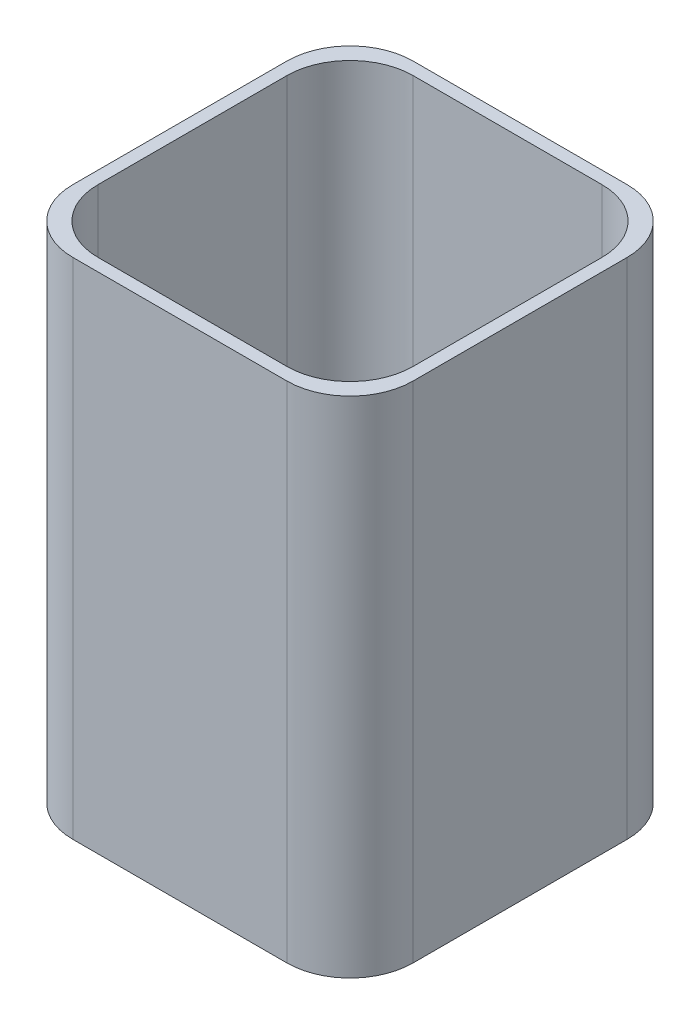
ISO-10303-21;
HEADER;
FILE_DESCRIPTION(('STEP AP214'),'2;1');
FILE_NAME('part.step','',(''),(''),'','','');
FILE_SCHEMA(('AUTOMOTIVE_DESIGN { 1 0 10303 214 1 1 1 1 }'));
ENDSEC;
DATA;
#1=APPLICATION_CONTEXT('core data for automotive mechanical design processes');
#2=APPLICATION_PROTOCOL_DEFINITION('international standard','automotive_design',2000,#1);
#3=PRODUCT_CONTEXT('',#1,'mechanical');
#4=PRODUCT('Part','Part','',(#3));
#5=PRODUCT_RELATED_PRODUCT_CATEGORY('part','',(#4));
#6=PRODUCT_DEFINITION_FORMATION('','',#4);
#7=PRODUCT_DEFINITION_CONTEXT('part definition',#1,'design');
#8=PRODUCT_DEFINITION('design','',#6,#7);
#9=PRODUCT_DEFINITION_SHAPE('','',#8);
#10=(LENGTH_UNIT() NAMED_UNIT(*) SI_UNIT(.MILLI.,.METRE.));
#11=(NAMED_UNIT(*) PLANE_ANGLE_UNIT() SI_UNIT($,.RADIAN.));
#12=(NAMED_UNIT(*) SI_UNIT($,.STERADIAN.) SOLID_ANGLE_UNIT());
#13=UNCERTAINTY_MEASURE_WITH_UNIT(LENGTH_MEASURE(1.E-05),#10,'distance_accuracy_value','');
#14=(GEOMETRIC_REPRESENTATION_CONTEXT(3) GLOBAL_UNCERTAINTY_ASSIGNED_CONTEXT((#13)) GLOBAL_UNIT_ASSIGNED_CONTEXT((#10,
#11,#12)) REPRESENTATION_CONTEXT('',''));
#15=CARTESIAN_POINT('',(0.,0.,0.));
#16=DIRECTION('',(0.,0.,1.));
#17=DIRECTION('',(1.,0.,0.));
#18=AXIS2_PLACEMENT_3D('',#15,#16,#17);
#19=CARTESIAN_POINT('',(-80.3315321017228,80.,-46.4451328481612));
#20=DIRECTION('',(1.,0.,0.));
#21=DIRECTION('',(0.,0.,-1.));
#22=AXIS2_PLACEMENT_3D('',#19,#20,#21);
#23=PLANE('',#22);
#24=DIRECTION('',(0.,0.,1.));
#25=VECTOR('',#24,1.);
#26=CARTESIAN_POINT('',(-80.3315321017228,80.,-46.4451328481612));
#27=LINE('',#26,#25);
#28=CARTESIAN_POINT('',(-80.3315321017228,80.,-36.4451328481612));
#29=VERTEX_POINT('',#28);
#30=CARTESIAN_POINT('',(-80.3315321017228,80.,-2.44513284816123));
#31=VERTEX_POINT('',#30);
#32=EDGE_CURVE('E186',#29,#31,#27,.T.);
#33=ORIENTED_EDGE('',*,*,#32,.F.);
#34=DIRECTION('',(0.,-1.,0.));
#35=VECTOR('',#34,1.);
#36=CARTESIAN_POINT('',(-80.3315321017228,80.,-36.4451328481612));
#37=LINE('',#36,#35);
#38=CARTESIAN_POINT('',(-80.3315321017228,0.,-36.4451328481612));
#39=VERTEX_POINT('',#38);
#40=EDGE_CURVE('E235',#29,#39,#37,.T.);
#41=ORIENTED_EDGE('',*,*,#40,.T.);
#42=DIRECTION('',(0.,0.,1.));
#43=VECTOR('',#42,1.);
#44=CARTESIAN_POINT('',(-80.3315321017228,0.,-46.4451328481612));
#45=LINE('',#44,#43);
#46=CARTESIAN_POINT('',(-80.3315321017228,0.,-2.44513284816123));
#47=VERTEX_POINT('',#46);
#48=EDGE_CURVE('E197',#39,#47,#45,.T.);
#49=ORIENTED_EDGE('',*,*,#48,.T.);
#50=DIRECTION('',(0.,-1.,0.));
#51=VECTOR('',#50,1.);
#52=CARTESIAN_POINT('',(-80.3315321017228,80.,-2.44513284816123));
#53=LINE('',#52,#51);
#54=EDGE_CURVE('E233',#47,#31,#53,.F.);
#55=ORIENTED_EDGE('',*,*,#54,.T.);
#56=EDGE_LOOP('',(#33,#41,#49,#55));
#57=FACE_BOUND('',#56,.T.);
#58=ADVANCED_FACE('F33',(#57),#23,.F.);
#59=CARTESIAN_POINT('',(-80.3315321017228,80.,7.55486715183876));
#60=DIRECTION('',(0.,0.,-1.));
#61=DIRECTION('',(-1.,0.,0.));
#62=AXIS2_PLACEMENT_3D('',#59,#60,#61);
#63=PLANE('',#62);
#64=DIRECTION('',(1.,0.,0.));
#65=VECTOR('',#64,1.);
#66=CARTESIAN_POINT('',(-80.3315321017228,0.,7.55486715183876));
#67=LINE('',#66,#65);
#68=CARTESIAN_POINT('',(-70.3315321017228,0.,7.55486715183876));
#69=VERTEX_POINT('',#68);
#70=CARTESIAN_POINT('',(-36.3315321017228,0.,7.55486715183876));
#71=VERTEX_POINT('',#70);
#72=EDGE_CURVE('E200',#69,#71,#67,.T.);
#73=ORIENTED_EDGE('',*,*,#72,.T.);
#74=DIRECTION('',(0.,-1.,0.));
#75=VECTOR('',#74,1.);
#76=CARTESIAN_POINT('',(-36.3315321017228,80.,7.55486715183876));
#77=LINE('',#76,#75);
#78=CARTESIAN_POINT('',(-36.3315321017228,80.,7.55486715183876));
#79=VERTEX_POINT('',#78);
#80=EDGE_CURVE('E11',#71,#79,#77,.F.);
#81=ORIENTED_EDGE('',*,*,#80,.T.);
#82=DIRECTION('',(1.,0.,0.));
#83=VECTOR('',#82,1.);
#84=CARTESIAN_POINT('',(-80.3315321017228,80.,7.55486715183876));
#85=LINE('',#84,#83);
#86=CARTESIAN_POINT('',(-70.3315321017228,80.,7.55486715183876));
#87=VERTEX_POINT('',#86);
#88=EDGE_CURVE('E189',#87,#79,#85,.T.);
#89=ORIENTED_EDGE('',*,*,#88,.F.);
#90=DIRECTION('',(0.,-1.,0.));
#91=VECTOR('',#90,1.);
#92=CARTESIAN_POINT('',(-70.3315321017228,80.,7.55486715183876));
#93=LINE('',#92,#91);
#94=EDGE_CURVE('E41',#87,#69,#93,.T.);
#95=ORIENTED_EDGE('',*,*,#94,.T.);
#96=EDGE_LOOP('',(#73,#81,#89,#95));
#97=FACE_BOUND('',#96,.T.);
#98=ADVANCED_FACE('F266',(#97),#63,.F.);
#99=CARTESIAN_POINT('',(-26.3315321017228,80.,-46.4451328481612));
#100=DIRECTION('',(-1.,0.,0.));
#101=DIRECTION('',(0.,0.,1.));
#102=AXIS2_PLACEMENT_3D('',#99,#100,#101);
#103=PLANE('',#102);
#104=DIRECTION('',(0.,0.,-1.));
#105=VECTOR('',#104,1.);
#106=CARTESIAN_POINT('',(-26.3315321017228,0.,-46.4451328481612));
#107=LINE('',#106,#105);
#108=CARTESIAN_POINT('',(-26.3315321017228,0.,-2.44513284816124));
#109=VERTEX_POINT('',#108);
#110=CARTESIAN_POINT('',(-26.3315321017228,0.,-36.4451328481612));
#111=VERTEX_POINT('',#110);
#112=EDGE_CURVE('E204',#109,#111,#107,.T.);
#113=ORIENTED_EDGE('',*,*,#112,.T.);
#114=DIRECTION('',(0.,-1.,0.));
#115=VECTOR('',#114,1.);
#116=CARTESIAN_POINT('',(-26.3315321017228,80.,-36.4451328481612));
#117=LINE('',#116,#115);
#118=CARTESIAN_POINT('',(-26.3315321017228,80.,-36.4451328481612));
#119=VERTEX_POINT('',#118);
#120=EDGE_CURVE('E48',#111,#119,#117,.F.);
#121=ORIENTED_EDGE('',*,*,#120,.T.);
#122=DIRECTION('',(0.,0.,-1.));
#123=VECTOR('',#122,1.);
#124=CARTESIAN_POINT('',(-26.3315321017228,80.,-46.4451328481612));
#125=LINE('',#124,#123);
#126=CARTESIAN_POINT('',(-26.3315321017228,80.,-2.44513284816124));
#127=VERTEX_POINT('',#126);
#128=EDGE_CURVE('E192',#127,#119,#125,.T.);
#129=ORIENTED_EDGE('',*,*,#128,.F.);
#130=DIRECTION('',(0.,-1.,0.));
#131=VECTOR('',#130,1.);
#132=CARTESIAN_POINT('',(-26.3315321017228,80.,-2.44513284816124));
#133=LINE('',#132,#131);
#134=EDGE_CURVE('E258',#127,#109,#133,.T.);
#135=ORIENTED_EDGE('',*,*,#134,.T.);
#136=EDGE_LOOP('',(#113,#121,#129,#135));
#137=FACE_BOUND('',#136,.T.);
#138=ADVANCED_FACE('F277',(#137),#103,.F.);
#139=CARTESIAN_POINT('',(-80.3315321017228,80.,-46.4451328481612));
#140=DIRECTION('',(0.,0.,1.));
#141=DIRECTION('',(1.,0.,0.));
#142=AXIS2_PLACEMENT_3D('',#139,#140,#141);
#143=PLANE('',#142);
#144=DIRECTION('',(-1.,0.,0.));
#145=VECTOR('',#144,1.);
#146=CARTESIAN_POINT('',(-80.3315321017228,0.,-46.4451328481612));
#147=LINE('',#146,#145);
#148=CARTESIAN_POINT('',(-36.3315321017228,0.,-46.4451328481612));
#149=VERTEX_POINT('',#148);
#150=CARTESIAN_POINT('',(-70.3315321017229,0.,-46.4451328481612));
#151=VERTEX_POINT('',#150);
#152=EDGE_CURVE('E190',#149,#151,#147,.T.);
#153=ORIENTED_EDGE('',*,*,#152,.T.);
#154=DIRECTION('',(0.,-1.,0.));
#155=VECTOR('',#154,1.);
#156=CARTESIAN_POINT('',(-70.3315321017229,80.,-46.4451328481612));
#157=LINE('',#156,#155);
#158=CARTESIAN_POINT('',(-70.3315321017229,80.,-46.4451328481612));
#159=VERTEX_POINT('',#158);
#160=EDGE_CURVE('E249',#151,#159,#157,.F.);
#161=ORIENTED_EDGE('',*,*,#160,.T.);
#162=DIRECTION('',(-1.,0.,0.));
#163=VECTOR('',#162,1.);
#164=CARTESIAN_POINT('',(-80.3315321017228,80.,-46.4451328481612));
#165=LINE('',#164,#163);
#166=CARTESIAN_POINT('',(-36.3315321017228,80.,-46.4451328481612));
#167=VERTEX_POINT('',#166);
#168=EDGE_CURVE('E194',#167,#159,#165,.T.);
#169=ORIENTED_EDGE('',*,*,#168,.F.);
#170=DIRECTION('',(0.,-1.,0.));
#171=VECTOR('',#170,1.);
#172=CARTESIAN_POINT('',(-36.3315321017228,80.,-46.4451328481612));
#173=LINE('',#172,#171);
#174=EDGE_CURVE('E246',#167,#149,#173,.T.);
#175=ORIENTED_EDGE('',*,*,#174,.T.);
#176=EDGE_LOOP('',(#153,#161,#169,#175));
#177=FACE_BOUND('',#176,.T.);
#178=ADVANCED_FACE('F285',(#177),#143,.F.);
#179=CARTESIAN_POINT('',(0.,80.,0.));
#180=DIRECTION('',(0.,1.,0.));
#181=DIRECTION('',(0.,0.,1.));
#182=AXIS2_PLACEMENT_3D('',#179,#180,#181);
#183=PLANE('',#182);
#184=DIRECTION('',(0.,0.,1.));
#185=VECTOR('',#184,1.);
#186=CARTESIAN_POINT('',(-78.3315321017228,80.,-44.4451328481612));
#187=LINE('',#186,#185);
#188=CARTESIAN_POINT('',(-78.3315321017228,80.,-34.4451328481612));
#189=VERTEX_POINT('',#188);
#190=CARTESIAN_POINT('',(-78.3315321017228,80.,-4.44513284816123));
#191=VERTEX_POINT('',#190);
#192=EDGE_CURVE('E175',#189,#191,#187,.T.);
#193=ORIENTED_EDGE('',*,*,#192,.F.);
#194=CARTESIAN_POINT('',(-68.3315321017229,80.,-34.4451328481612));
#195=DIRECTION('',(0.,1.,0.));
#196=DIRECTION('',(0.,0.,1.));
#197=AXIS2_PLACEMENT_3D('',#194,#195,#196);
#198=CIRCLE('',#197,10.);
#199=CARTESIAN_POINT('',(-68.3315321017229,80.,-44.4451328481612));
#200=VERTEX_POINT('',#199);
#201=EDGE_CURVE('E157',#189,#200,#198,.F.);
#202=ORIENTED_EDGE('',*,*,#201,.T.);
#203=DIRECTION('',(-1.,0.,0.));
#204=VECTOR('',#203,1.);
#205=CARTESIAN_POINT('',(-78.3315321017228,80.,-44.4451328481612));
#206=LINE('',#205,#204);
#207=CARTESIAN_POINT('',(-38.3315321017228,80.,-44.4451328481612));
#208=VERTEX_POINT('',#207);
#209=EDGE_CURVE('E178',#208,#200,#206,.T.);
#210=ORIENTED_EDGE('',*,*,#209,.F.);
#211=CARTESIAN_POINT('',(-38.3315321017228,80.,-34.4451328481612));
#212=DIRECTION('',(0.,1.,0.));
#213=DIRECTION('',(0.,0.,1.));
#214=AXIS2_PLACEMENT_3D('',#211,#212,#213);
#215=CIRCLE('',#214,10.);
#216=CARTESIAN_POINT('',(-28.3315321017228,80.,-34.4451328481612));
#217=VERTEX_POINT('',#216);
#218=EDGE_CURVE('E231',#208,#217,#215,.F.);
#219=ORIENTED_EDGE('',*,*,#218,.T.);
#220=DIRECTION('',(0.,0.,-1.));
#221=VECTOR('',#220,1.);
#222=CARTESIAN_POINT('',(-28.3315321017228,80.,-44.4451328481612));
#223=LINE('',#222,#221);
#224=CARTESIAN_POINT('',(-28.3315321017228,80.,-4.44513284816123));
#225=VERTEX_POINT('',#224);
#226=EDGE_CURVE('E174',#225,#217,#223,.T.);
#227=ORIENTED_EDGE('',*,*,#226,.F.);
#228=CARTESIAN_POINT('',(-38.3315321017228,80.,-4.44513284816123));
#229=DIRECTION('',(0.,1.,0.));
#230=DIRECTION('',(0.,0.,1.));
#231=AXIS2_PLACEMENT_3D('',#228,#229,#230);
#232=CIRCLE('',#231,10.);
#233=CARTESIAN_POINT('',(-38.3315321017228,80.,5.55486715183877));
#234=VERTEX_POINT('',#233);
#235=EDGE_CURVE('E173',#225,#234,#232,.F.);
#236=ORIENTED_EDGE('',*,*,#235,.T.);
#237=DIRECTION('',(1.,0.,0.));
#238=VECTOR('',#237,1.);
#239=CARTESIAN_POINT('',(-78.3315321017228,80.,5.55486715183877));
#240=LINE('',#239,#238);
#241=CARTESIAN_POINT('',(-68.3315321017229,80.,5.55486715183877));
#242=VERTEX_POINT('',#241);
#243=EDGE_CURVE('E164',#242,#234,#240,.T.);
#244=ORIENTED_EDGE('',*,*,#243,.F.);
#245=CARTESIAN_POINT('',(-68.3315321017229,80.,-4.44513284816123));
#246=DIRECTION('',(0.,1.,0.));
#247=DIRECTION('',(0.,0.,1.));
#248=AXIS2_PLACEMENT_3D('',#245,#246,#247);
#249=CIRCLE('',#248,10.);
#250=EDGE_CURVE('E147',#242,#191,#249,.F.);
#251=ORIENTED_EDGE('',*,*,#250,.T.);
#252=EDGE_LOOP('',(#193,#202,#210,#219,#227,#236,#244,#251));
#253=FACE_BOUND('',#252,.T.);
#254=ORIENTED_EDGE('',*,*,#168,.T.);
#255=CARTESIAN_POINT('',(-70.3315321017229,80.,-36.4451328481612));
#256=DIRECTION('',(0.,1.,0.));
#257=DIRECTION('',(0.,0.,1.));
#258=AXIS2_PLACEMENT_3D('',#255,#256,#257);
#259=CIRCLE('',#258,10.);
#260=EDGE_CURVE('E256',#159,#29,#259,.T.);
#261=ORIENTED_EDGE('',*,*,#260,.T.);
#262=ORIENTED_EDGE('',*,*,#32,.T.);
#263=CARTESIAN_POINT('',(-70.3315321017228,80.,-2.44513284816124));
#264=DIRECTION('',(0.,1.,0.));
#265=DIRECTION('',(0.,0.,1.));
#266=AXIS2_PLACEMENT_3D('',#263,#264,#265);
#267=CIRCLE('',#266,10.);
#268=EDGE_CURVE('E251',#31,#87,#267,.T.);
#269=ORIENTED_EDGE('',*,*,#268,.T.);
#270=ORIENTED_EDGE('',*,*,#88,.T.);
#271=CARTESIAN_POINT('',(-36.3315321017228,80.,-2.44513284816124));
#272=DIRECTION('',(0.,1.,0.));
#273=DIRECTION('',(0.,0.,1.));
#274=AXIS2_PLACEMENT_3D('',#271,#272,#273);
#275=CIRCLE('',#274,10.);
#276=EDGE_CURVE('E55',#79,#127,#275,.T.);
#277=ORIENTED_EDGE('',*,*,#276,.T.);
#278=ORIENTED_EDGE('',*,*,#128,.T.);
#279=CARTESIAN_POINT('',(-36.3315321017228,80.,-36.4451328481612));
#280=DIRECTION('',(0.,1.,0.));
#281=DIRECTION('',(0.,0.,1.));
#282=AXIS2_PLACEMENT_3D('',#279,#280,#281);
#283=CIRCLE('',#282,10.);
#284=EDGE_CURVE('E254',#119,#167,#283,.T.);
#285=ORIENTED_EDGE('',*,*,#284,.T.);
#286=EDGE_LOOP('',(#254,#261,#262,#269,#270,#277,#278,#285));
#287=FACE_BOUND('',#286,.T.);
#288=ADVANCED_FACE('F171',(#253,#287),#183,.T.);
#289=CARTESIAN_POINT('',(0.,0.,0.));
#290=DIRECTION('',(0.,1.,0.));
#291=DIRECTION('',(0.,0.,1.));
#292=AXIS2_PLACEMENT_3D('',#289,#290,#291);
#293=PLANE('',#292);
#294=ORIENTED_EDGE('',*,*,#48,.F.);
#295=CARTESIAN_POINT('',(-70.3315321017229,0.,-36.4451328481612));
#296=DIRECTION('',(0.,1.,0.));
#297=DIRECTION('',(0.,0.,1.));
#298=AXIS2_PLACEMENT_3D('',#295,#296,#297);
#299=CIRCLE('',#298,10.);
#300=EDGE_CURVE('E244',#39,#151,#299,.F.);
#301=ORIENTED_EDGE('',*,*,#300,.T.);
#302=ORIENTED_EDGE('',*,*,#152,.F.);
#303=CARTESIAN_POINT('',(-36.3315321017228,0.,-36.4451328481612));
#304=DIRECTION('',(0.,1.,0.));
#305=DIRECTION('',(0.,0.,1.));
#306=AXIS2_PLACEMENT_3D('',#303,#304,#305);
#307=CIRCLE('',#306,10.);
#308=EDGE_CURVE('E242',#149,#111,#307,.F.);
#309=ORIENTED_EDGE('',*,*,#308,.T.);
#310=ORIENTED_EDGE('',*,*,#112,.F.);
#311=CARTESIAN_POINT('',(-36.3315321017228,0.,-2.44513284816124));
#312=DIRECTION('',(0.,1.,0.));
#313=DIRECTION('',(0.,0.,1.));
#314=AXIS2_PLACEMENT_3D('',#311,#312,#313);
#315=CIRCLE('',#314,10.);
#316=EDGE_CURVE('E240',#109,#71,#315,.F.);
#317=ORIENTED_EDGE('',*,*,#316,.T.);
#318=ORIENTED_EDGE('',*,*,#72,.F.);
#319=CARTESIAN_POINT('',(-70.3315321017228,0.,-2.44513284816124));
#320=DIRECTION('',(0.,1.,0.));
#321=DIRECTION('',(0.,0.,1.));
#322=AXIS2_PLACEMENT_3D('',#319,#320,#321);
#323=CIRCLE('',#322,10.);
#324=EDGE_CURVE('E238',#69,#47,#323,.F.);
#325=ORIENTED_EDGE('',*,*,#324,.T.);
#326=EDGE_LOOP('',(#294,#301,#302,#309,#310,#317,#318,#325));
#327=FACE_BOUND('',#326,.T.);
#328=ADVANCED_FACE('F272',(#327),#293,.F.);
#329=CARTESIAN_POINT('',(-78.3315321017228,2.,-44.4451328481612));
#330=DIRECTION('',(-1.,0.,0.));
#331=DIRECTION('',(0.,0.,1.));
#332=AXIS2_PLACEMENT_3D('',#329,#330,#331);
#333=PLANE('',#332);
#334=ORIENTED_EDGE('',*,*,#192,.T.);
#335=DIRECTION('',(0.,1.,0.));
#336=VECTOR('',#335,1.);
#337=CARTESIAN_POINT('',(-78.3315321017228,2.,-4.44513284816123));
#338=LINE('',#337,#336);
#339=CARTESIAN_POINT('',(-78.3315321017228,2.,-4.44513284816123));
#340=VERTEX_POINT('',#339);
#341=EDGE_CURVE('E152',#191,#340,#338,.F.);
#342=ORIENTED_EDGE('',*,*,#341,.T.);
#343=DIRECTION('',(0.,0.,1.));
#344=VECTOR('',#343,1.);
#345=CARTESIAN_POINT('',(-78.3315321017228,2.,-44.4451328481612));
#346=LINE('',#345,#344);
#347=CARTESIAN_POINT('',(-78.3315321017228,2.,-34.4451328481612));
#348=VERTEX_POINT('',#347);
#349=EDGE_CURVE('E185',#348,#340,#346,.T.);
#350=ORIENTED_EDGE('',*,*,#349,.F.);
#351=DIRECTION('',(0.,1.,0.));
#352=VECTOR('',#351,1.);
#353=CARTESIAN_POINT('',(-78.3315321017228,80.,-34.4451328481612));
#354=LINE('',#353,#352);
#355=EDGE_CURVE('E168',#348,#189,#354,.T.);
#356=ORIENTED_EDGE('',*,*,#355,.T.);
#357=EDGE_LOOP('',(#334,#342,#350,#356));
#358=FACE_BOUND('',#357,.T.);
#359=ADVANCED_FACE('F398',(#358),#333,.F.);
#360=CARTESIAN_POINT('',(-78.3315321017228,2.,-44.4451328481612));
#361=DIRECTION('',(0.,0.,-1.));
#362=DIRECTION('',(-1.,0.,0.));
#363=AXIS2_PLACEMENT_3D('',#360,#361,#362);
#364=PLANE('',#363);
#365=ORIENTED_EDGE('',*,*,#209,.T.);
#366=DIRECTION('',(0.,1.,0.));
#367=VECTOR('',#366,1.);
#368=CARTESIAN_POINT('',(-68.3315321017229,2.,-44.4451328481612));
#369=LINE('',#368,#367);
#370=CARTESIAN_POINT('',(-68.3315321017229,2.,-44.4451328481612));
#371=VERTEX_POINT('',#370);
#372=EDGE_CURVE('E223',#200,#371,#369,.F.);
#373=ORIENTED_EDGE('',*,*,#372,.T.);
#374=DIRECTION('',(-1.,0.,0.));
#375=VECTOR('',#374,1.);
#376=CARTESIAN_POINT('',(-78.3315321017228,2.,-44.4451328481612));
#377=LINE('',#376,#375);
#378=CARTESIAN_POINT('',(-38.3315321017228,2.,-44.4451328481612));
#379=VERTEX_POINT('',#378);
#380=EDGE_CURVE('E201',#379,#371,#377,.T.);
#381=ORIENTED_EDGE('',*,*,#380,.F.);
#382=DIRECTION('',(0.,1.,0.));
#383=VECTOR('',#382,1.);
#384=CARTESIAN_POINT('',(-38.3315321017228,80.,-44.4451328481612));
#385=LINE('',#384,#383);
#386=EDGE_CURVE('E220',#379,#208,#385,.T.);
#387=ORIENTED_EDGE('',*,*,#386,.T.);
#388=EDGE_LOOP('',(#365,#373,#381,#387));
#389=FACE_BOUND('',#388,.T.);
#390=ADVANCED_FACE('F389',(#389),#364,.F.);
#391=CARTESIAN_POINT('',(-28.3315321017228,2.,-44.4451328481612));
#392=DIRECTION('',(1.,0.,0.));
#393=DIRECTION('',(0.,0.,-1.));
#394=AXIS2_PLACEMENT_3D('',#391,#392,#393);
#395=PLANE('',#394);
#396=DIRECTION('',(0.,0.,-1.));
#397=VECTOR('',#396,1.);
#398=CARTESIAN_POINT('',(-28.3315321017228,2.,-44.4451328481612));
#399=LINE('',#398,#397);
#400=CARTESIAN_POINT('',(-28.3315321017228,2.,-4.44513284816123));
#401=VERTEX_POINT('',#400);
#402=CARTESIAN_POINT('',(-28.3315321017228,2.,-34.4451328481612));
#403=VERTEX_POINT('',#402);
#404=EDGE_CURVE('E468',#401,#403,#399,.T.);
#405=ORIENTED_EDGE('',*,*,#404,.F.);
#406=DIRECTION('',(0.,1.,0.));
#407=VECTOR('',#406,1.);
#408=CARTESIAN_POINT('',(-28.3315321017228,80.,-4.44513284816123));
#409=LINE('',#408,#407);
#410=EDGE_CURVE('E158',#401,#225,#409,.T.);
#411=ORIENTED_EDGE('',*,*,#410,.T.);
#412=ORIENTED_EDGE('',*,*,#226,.T.);
#413=DIRECTION('',(0.,1.,0.));
#414=VECTOR('',#413,1.);
#415=CARTESIAN_POINT('',(-28.3315321017228,2.,-34.4451328481612));
#416=LINE('',#415,#414);
#417=EDGE_CURVE('E225',#217,#403,#416,.F.);
#418=ORIENTED_EDGE('',*,*,#417,.T.);
#419=EDGE_LOOP('',(#405,#411,#412,#418));
#420=FACE_BOUND('',#419,.T.);
#421=ADVANCED_FACE('F381',(#420),#395,.F.);
#422=CARTESIAN_POINT('',(-78.3315321017228,2.,5.55486715183877));
#423=DIRECTION('',(0.,0.,1.));
#424=DIRECTION('',(1.,0.,0.));
#425=AXIS2_PLACEMENT_3D('',#422,#423,#424);
#426=PLANE('',#425);
#427=DIRECTION('',(1.,0.,0.));
#428=VECTOR('',#427,1.);
#429=CARTESIAN_POINT('',(-78.3315321017228,2.,5.55486715183877));
#430=LINE('',#429,#428);
#431=CARTESIAN_POINT('',(-68.3315321017229,2.,5.55486715183877));
#432=VERTEX_POINT('',#431);
#433=CARTESIAN_POINT('',(-38.3315321017228,2.,5.55486715183877));
#434=VERTEX_POINT('',#433);
#435=EDGE_CURVE('E167',#432,#434,#430,.T.);
#436=ORIENTED_EDGE('',*,*,#435,.F.);
#437=DIRECTION('',(0.,1.,0.));
#438=VECTOR('',#437,1.);
#439=CARTESIAN_POINT('',(-68.3315321017229,80.,5.55486715183877));
#440=LINE('',#439,#438);
#441=EDGE_CURVE('E151',#432,#242,#440,.T.);
#442=ORIENTED_EDGE('',*,*,#441,.T.);
#443=ORIENTED_EDGE('',*,*,#243,.T.);
#444=DIRECTION('',(0.,1.,0.));
#445=VECTOR('',#444,1.);
#446=CARTESIAN_POINT('',(-38.3315321017228,2.,5.55486715183877));
#447=LINE('',#446,#445);
#448=EDGE_CURVE('E169',#234,#434,#447,.F.);
#449=ORIENTED_EDGE('',*,*,#448,.T.);
#450=EDGE_LOOP('',(#436,#442,#443,#449));
#451=FACE_BOUND('',#450,.T.);
#452=ADVANCED_FACE('F163',(#451),#426,.F.);
#453=CARTESIAN_POINT('',(0.,2.,0.));
#454=DIRECTION('',(0.,1.,0.));
#455=DIRECTION('',(0.,0.,1.));
#456=AXIS2_PLACEMENT_3D('',#453,#454,#455);
#457=PLANE('',#456);
#458=ORIENTED_EDGE('',*,*,#349,.T.);
#459=CARTESIAN_POINT('',(-68.3315321017229,2.,-4.44513284816123));
#460=DIRECTION('',(0.,1.,0.));
#461=DIRECTION('',(0.,0.,1.));
#462=AXIS2_PLACEMENT_3D('',#459,#460,#461);
#463=CIRCLE('',#462,10.);
#464=EDGE_CURVE('E218',#340,#432,#463,.T.);
#465=ORIENTED_EDGE('',*,*,#464,.T.);
#466=ORIENTED_EDGE('',*,*,#435,.T.);
#467=CARTESIAN_POINT('',(-38.3315321017228,2.,-4.44513284816123));
#468=DIRECTION('',(0.,1.,0.));
#469=DIRECTION('',(0.,0.,1.));
#470=AXIS2_PLACEMENT_3D('',#467,#468,#469);
#471=CIRCLE('',#470,10.);
#472=EDGE_CURVE('E214',#434,#401,#471,.T.);
#473=ORIENTED_EDGE('',*,*,#472,.T.);
#474=ORIENTED_EDGE('',*,*,#404,.T.);
#475=CARTESIAN_POINT('',(-38.3315321017228,2.,-34.4451328481612));
#476=DIRECTION('',(0.,1.,0.));
#477=DIRECTION('',(0.,0.,1.));
#478=AXIS2_PLACEMENT_3D('',#475,#476,#477);
#479=CIRCLE('',#478,10.);
#480=EDGE_CURVE('E212',#403,#379,#479,.T.);
#481=ORIENTED_EDGE('',*,*,#480,.T.);
#482=ORIENTED_EDGE('',*,*,#380,.T.);
#483=CARTESIAN_POINT('',(-68.3315321017229,2.,-34.4451328481612));
#484=DIRECTION('',(0.,1.,0.));
#485=DIRECTION('',(0.,0.,1.));
#486=AXIS2_PLACEMENT_3D('',#483,#484,#485);
#487=CIRCLE('',#486,10.);
#488=EDGE_CURVE('E216',#371,#348,#487,.T.);
#489=ORIENTED_EDGE('',*,*,#488,.T.);
#490=EDGE_LOOP('',(#458,#465,#466,#473,#474,#481,#482,#489));
#491=FACE_BOUND('',#490,.T.);
#492=ADVANCED_FACE('F309',(#491),#457,.T.);
#493=CARTESIAN_POINT('',(-68.3315321017229,2.,-4.44513284816123));
#494=DIRECTION('',(0.,-1.,0.));
#495=DIRECTION('',(0.,0.,-1.));
#496=AXIS2_PLACEMENT_3D('',#493,#494,#495);
#497=CYLINDRICAL_SURFACE('',#496,10.);
#498=ORIENTED_EDGE('',*,*,#464,.F.);
#499=ORIENTED_EDGE('',*,*,#341,.F.);
#500=ORIENTED_EDGE('',*,*,#250,.F.);
#501=ORIENTED_EDGE('',*,*,#441,.F.);
#502=EDGE_LOOP('',(#498,#499,#500,#501));
#503=FACE_BOUND('',#502,.T.);
#504=ADVANCED_FACE('F150',(#503),#497,.F.);
#505=CARTESIAN_POINT('',(-68.3315321017229,2.,-34.4451328481612));
#506=DIRECTION('',(0.,-1.,0.));
#507=DIRECTION('',(0.,0.,-1.));
#508=AXIS2_PLACEMENT_3D('',#505,#506,#507);
#509=CYLINDRICAL_SURFACE('',#508,10.);
#510=ORIENTED_EDGE('',*,*,#488,.F.);
#511=ORIENTED_EDGE('',*,*,#372,.F.);
#512=ORIENTED_EDGE('',*,*,#201,.F.);
#513=ORIENTED_EDGE('',*,*,#355,.F.);
#514=EDGE_LOOP('',(#510,#511,#512,#513));
#515=FACE_BOUND('',#514,.T.);
#516=ADVANCED_FACE('F308',(#515),#509,.F.);
#517=CARTESIAN_POINT('',(-38.3315321017228,2.,-4.44513284816123));
#518=DIRECTION('',(0.,-1.,0.));
#519=DIRECTION('',(0.,0.,-1.));
#520=AXIS2_PLACEMENT_3D('',#517,#518,#519);
#521=CYLINDRICAL_SURFACE('',#520,10.);
#522=ORIENTED_EDGE('',*,*,#472,.F.);
#523=ORIENTED_EDGE('',*,*,#448,.F.);
#524=ORIENTED_EDGE('',*,*,#235,.F.);
#525=ORIENTED_EDGE('',*,*,#410,.F.);
#526=EDGE_LOOP('',(#522,#523,#524,#525));
#527=FACE_BOUND('',#526,.T.);
#528=ADVANCED_FACE('F312',(#527),#521,.F.);
#529=CARTESIAN_POINT('',(-38.3315321017228,2.,-34.4451328481612));
#530=DIRECTION('',(0.,-1.,0.));
#531=DIRECTION('',(0.,0.,-1.));
#532=AXIS2_PLACEMENT_3D('',#529,#530,#531);
#533=CYLINDRICAL_SURFACE('',#532,10.);
#534=ORIENTED_EDGE('',*,*,#480,.F.);
#535=ORIENTED_EDGE('',*,*,#417,.F.);
#536=ORIENTED_EDGE('',*,*,#218,.F.);
#537=ORIENTED_EDGE('',*,*,#386,.F.);
#538=EDGE_LOOP('',(#534,#535,#536,#537));
#539=FACE_BOUND('',#538,.T.);
#540=ADVANCED_FACE('F316',(#539),#533,.F.);
#541=CARTESIAN_POINT('',(-70.3315321017229,80.,-36.4451328481612));
#542=DIRECTION('',(0.,-1.,0.));
#543=DIRECTION('',(0.,0.,-1.));
#544=AXIS2_PLACEMENT_3D('',#541,#542,#543);
#545=CYLINDRICAL_SURFACE('',#544,10.);
#546=ORIENTED_EDGE('',*,*,#260,.F.);
#547=ORIENTED_EDGE('',*,*,#160,.F.);
#548=ORIENTED_EDGE('',*,*,#300,.F.);
#549=ORIENTED_EDGE('',*,*,#40,.F.);
#550=EDGE_LOOP('',(#546,#547,#548,#549));
#551=FACE_BOUND('',#550,.T.);
#552=ADVANCED_FACE('F290',(#551),#545,.T.);
#553=CARTESIAN_POINT('',(-36.3315321017228,80.,-36.4451328481612));
#554=DIRECTION('',(0.,-1.,0.));
#555=DIRECTION('',(0.,0.,-1.));
#556=AXIS2_PLACEMENT_3D('',#553,#554,#555);
#557=CYLINDRICAL_SURFACE('',#556,10.);
#558=ORIENTED_EDGE('',*,*,#284,.F.);
#559=ORIENTED_EDGE('',*,*,#120,.F.);
#560=ORIENTED_EDGE('',*,*,#308,.F.);
#561=ORIENTED_EDGE('',*,*,#174,.F.);
#562=EDGE_LOOP('',(#558,#559,#560,#561));
#563=FACE_BOUND('',#562,.T.);
#564=ADVANCED_FACE('F282',(#563),#557,.T.);
#565=CARTESIAN_POINT('',(-36.3315321017228,80.,-2.44513284816124));
#566=DIRECTION('',(0.,-1.,0.));
#567=DIRECTION('',(0.,0.,-1.));
#568=AXIS2_PLACEMENT_3D('',#565,#566,#567);
#569=CYLINDRICAL_SURFACE('',#568,10.);
#570=ORIENTED_EDGE('',*,*,#276,.F.);
#571=ORIENTED_EDGE('',*,*,#80,.F.);
#572=ORIENTED_EDGE('',*,*,#316,.F.);
#573=ORIENTED_EDGE('',*,*,#134,.F.);
#574=EDGE_LOOP('',(#570,#571,#572,#573));
#575=FACE_BOUND('',#574,.T.);
#576=ADVANCED_FACE('F276',(#575),#569,.T.);
#577=CARTESIAN_POINT('',(-70.3315321017228,80.,-2.44513284816124));
#578=DIRECTION('',(0.,-1.,0.));
#579=DIRECTION('',(0.,0.,-1.));
#580=AXIS2_PLACEMENT_3D('',#577,#578,#579);
#581=CYLINDRICAL_SURFACE('',#580,10.);
#582=ORIENTED_EDGE('',*,*,#268,.F.);
#583=ORIENTED_EDGE('',*,*,#54,.F.);
#584=ORIENTED_EDGE('',*,*,#324,.F.);
#585=ORIENTED_EDGE('',*,*,#94,.F.);
#586=EDGE_LOOP('',(#582,#583,#584,#585));
#587=FACE_BOUND('',#586,.T.);
#588=ADVANCED_FACE('F35',(#587),#581,.T.);
#589=CLOSED_SHELL('',(#58,#98,#138,#178,#288,#328,#359,#390,#421,#452,#492,#504,#516,#528,#540,
#552,#564,#576,#588));
#590=MANIFOLD_SOLID_BREP('B2',#589);
#591=ADVANCED_BREP_SHAPE_REPRESENTATION('',(#18,#590),#14);
#592=SHAPE_DEFINITION_REPRESENTATION(#9,#591);
ENDSEC;
END-ISO-10303-21;
